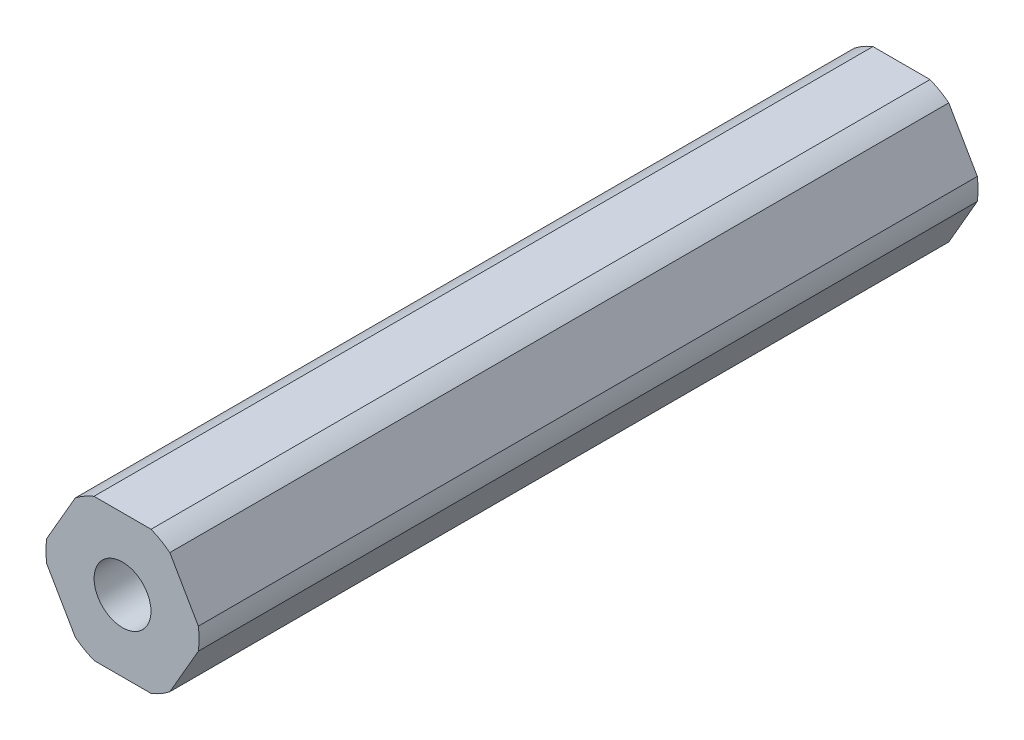
ISO-10303-21;
HEADER;
FILE_DESCRIPTION(('STEP AP214'),'2;1');
FILE_NAME('part.step','',(''),(''),'','','');
FILE_SCHEMA(('AUTOMOTIVE_DESIGN { 1 0 10303 214 1 1 1 1 }'));
ENDSEC;
DATA;
#1=APPLICATION_CONTEXT('core data for automotive mechanical design processes');
#2=APPLICATION_PROTOCOL_DEFINITION('international standard','automotive_design',2000,#1);
#3=PRODUCT_CONTEXT('',#1,'mechanical');
#4=PRODUCT('Part','Part','',(#3));
#5=PRODUCT_RELATED_PRODUCT_CATEGORY('part','',(#4));
#6=PRODUCT_DEFINITION_FORMATION('','',#4);
#7=PRODUCT_DEFINITION_CONTEXT('part definition',#1,'design');
#8=PRODUCT_DEFINITION('design','',#6,#7);
#9=PRODUCT_DEFINITION_SHAPE('','',#8);
#10=(LENGTH_UNIT() NAMED_UNIT(*) SI_UNIT(.MILLI.,.METRE.));
#11=(NAMED_UNIT(*) PLANE_ANGLE_UNIT() SI_UNIT($,.RADIAN.));
#12=(NAMED_UNIT(*) SI_UNIT($,.STERADIAN.) SOLID_ANGLE_UNIT());
#13=UNCERTAINTY_MEASURE_WITH_UNIT(LENGTH_MEASURE(1.E-05),#10,'distance_accuracy_value','');
#14=(GEOMETRIC_REPRESENTATION_CONTEXT(3) GLOBAL_UNCERTAINTY_ASSIGNED_CONTEXT((#13)) GLOBAL_UNIT_ASSIGNED_CONTEXT((#10,
#11,#12)) REPRESENTATION_CONTEXT('',''));
#15=CARTESIAN_POINT('',(0.,0.,0.));
#16=DIRECTION('',(0.,0.,1.));
#17=DIRECTION('',(1.,0.,0.));
#18=AXIS2_PLACEMENT_3D('',#15,#16,#17);
#19=CARTESIAN_POINT('',(0.,0.,-457.2));
#20=DIRECTION('',(0.,0.,1.));
#21=DIRECTION('',(1.,0.,0.));
#22=AXIS2_PLACEMENT_3D('',#19,#20,#21);
#23=CYLINDRICAL_SURFACE('',#22,6.87);
#24=CARTESIAN_POINT('',(0.,0.,387.35));
#25=DIRECTION('',(0.,0.,1.));
#26=DIRECTION('',(1.,0.,0.));
#27=AXIS2_PLACEMENT_3D('',#24,#25,#26);
#28=CIRCLE('',#27,6.87);
#29=CARTESIAN_POINT('',(6.80102150534208,0.971085209378948,387.35));
#30=VERTEX_POINT('',#29);
#31=CARTESIAN_POINT('',(6.80102150534208,-0.971085209378953,387.35));
#32=VERTEX_POINT('',#31);
#33=EDGE_CURVE('E248',#30,#32,#28,.F.);
#34=ORIENTED_EDGE('',*,*,#33,.F.);
#35=DIRECTION('',(0.,0.,1.));
#36=VECTOR('',#35,1.);
#37=CARTESIAN_POINT('',(6.80102150534208,0.97108520937895,457.2));
#38=LINE('',#37,#36);
#39=CARTESIAN_POINT('',(6.80102150534208,0.971085209378948,457.2));
#40=VERTEX_POINT('',#39);
#41=EDGE_CURVE('E139',#30,#40,#38,.T.);
#42=ORIENTED_EDGE('',*,*,#41,.T.);
#43=CARTESIAN_POINT('',(0.,0.,457.2));
#44=DIRECTION('',(0.,0.,1.));
#45=DIRECTION('',(1.,0.,0.));
#46=AXIS2_PLACEMENT_3D('',#43,#44,#45);
#47=CIRCLE('',#46,6.87);
#48=CARTESIAN_POINT('',(6.80102150534208,-0.971085209378954,457.2));
#49=VERTEX_POINT('',#48);
#50=EDGE_CURVE('E58',#40,#49,#47,.F.);
#51=ORIENTED_EDGE('',*,*,#50,.T.);
#52=DIRECTION('',(0.,0.,1.));
#53=VECTOR('',#52,1.);
#54=CARTESIAN_POINT('',(6.80102150534208,-0.971085209378955,457.2));
#55=LINE('',#54,#53);
#56=EDGE_CURVE('E154',#49,#32,#55,.F.);
#57=ORIENTED_EDGE('',*,*,#56,.T.);
#58=EDGE_LOOP('',(#34,#42,#51,#57));
#59=FACE_BOUND('',#58,.T.);
#60=ADVANCED_FACE('F34',(#59),#23,.T.);
#61=CARTESIAN_POINT('',(3.68083890619154,6.3754,457.2));
#62=DIRECTION('',(0.,-1.,0.));
#63=DIRECTION('',(1.,0.,0.));
#64=AXIS2_PLACEMENT_3D('',#61,#62,#63);
#65=PLANE('',#64);
#66=DIRECTION('',(0.,0.,1.));
#67=VECTOR('',#66,1.);
#68=CARTESIAN_POINT('',(2.55952629210953,6.37540000000001,-457.2));
#69=LINE('',#68,#67);
#70=CARTESIAN_POINT('',(2.55952629210953,6.37540000000001,387.35));
#71=VERTEX_POINT('',#70);
#72=CARTESIAN_POINT('',(2.55952629210953,6.37540000000001,457.2));
#73=VERTEX_POINT('',#72);
#74=EDGE_CURVE('E144',#71,#73,#69,.T.);
#75=ORIENTED_EDGE('',*,*,#74,.F.);
#76=DIRECTION('',(-1.,0.,0.));
#77=VECTOR('',#76,1.);
#78=CARTESIAN_POINT('',(3.68083890619154,6.3754,387.35));
#79=LINE('',#78,#77);
#80=CARTESIAN_POINT('',(-2.55952629210953,6.3754,387.35));
#81=VERTEX_POINT('',#80);
#82=EDGE_CURVE('E50',#71,#81,#79,.T.);
#83=ORIENTED_EDGE('',*,*,#82,.T.);
#84=DIRECTION('',(0.,0.,1.));
#85=VECTOR('',#84,1.);
#86=CARTESIAN_POINT('',(-2.55952629210953,6.37540000000001,-457.2));
#87=LINE('',#86,#85);
#88=CARTESIAN_POINT('',(-2.55952629210953,6.37540000000001,457.2));
#89=VERTEX_POINT('',#88);
#90=EDGE_CURVE('E171',#89,#81,#87,.F.);
#91=ORIENTED_EDGE('',*,*,#90,.F.);
#92=DIRECTION('',(1.,0.,0.));
#93=VECTOR('',#92,1.);
#94=CARTESIAN_POINT('',(0.,6.3754,457.2));
#95=LINE('',#94,#93);
#96=EDGE_CURVE('E189',#73,#89,#95,.F.);
#97=ORIENTED_EDGE('',*,*,#96,.F.);
#98=EDGE_LOOP('',(#75,#83,#91,#97));
#99=FACE_BOUND('',#98,.T.);
#100=ADVANCED_FACE('F211',(#99),#65,.F.);
#101=CARTESIAN_POINT('',(0.,0.,-457.2));
#102=DIRECTION('',(0.,0.,1.));
#103=DIRECTION('',(1.,0.,0.));
#104=AXIS2_PLACEMENT_3D('',#101,#102,#103);
#105=CYLINDRICAL_SURFACE('',#104,6.87);
#106=CARTESIAN_POINT('',(0.,0.,387.35));
#107=DIRECTION('',(0.,0.,1.));
#108=DIRECTION('',(1.,0.,0.));
#109=AXIS2_PLACEMENT_3D('',#106,#107,#108);
#110=CIRCLE('',#109,6.87);
#111=CARTESIAN_POINT('',(-4.24149521323255,5.40431479062104,387.35));
#112=VERTEX_POINT('',#111);
#113=EDGE_CURVE('E190',#112,#81,#110,.F.);
#114=ORIENTED_EDGE('',*,*,#113,.F.);
#115=DIRECTION('',(0.,0.,1.));
#116=VECTOR('',#115,1.);
#117=CARTESIAN_POINT('',(-4.24149521323255,5.40431479062104,457.2));
#118=LINE('',#117,#116);
#119=CARTESIAN_POINT('',(-4.24149521323255,5.40431479062105,457.2));
#120=VERTEX_POINT('',#119);
#121=EDGE_CURVE('E169',#112,#120,#118,.T.);
#122=ORIENTED_EDGE('',*,*,#121,.T.);
#123=CARTESIAN_POINT('',(0.,0.,457.2));
#124=DIRECTION('',(0.,0.,1.));
#125=DIRECTION('',(1.,0.,0.));
#126=AXIS2_PLACEMENT_3D('',#123,#124,#125);
#127=CIRCLE('',#126,6.87);
#128=EDGE_CURVE('E186',#89,#120,#127,.T.);
#129=ORIENTED_EDGE('',*,*,#128,.F.);
#130=ORIENTED_EDGE('',*,*,#90,.T.);
#131=EDGE_LOOP('',(#114,#122,#129,#130));
#132=FACE_BOUND('',#131,.T.);
#133=ADVANCED_FACE('F213',(#132),#105,.T.);
#134=CARTESIAN_POINT('',(-3.68083890619154,6.3754,457.2));
#135=DIRECTION('',(0.866025403784439,-0.5,0.));
#136=DIRECTION('',(0.5,0.866025403784439,0.));
#137=AXIS2_PLACEMENT_3D('',#134,#135,#136);
#138=PLANE('',#137);
#139=ORIENTED_EDGE('',*,*,#121,.F.);
#140=DIRECTION('',(-0.5,-0.866025403784439,0.));
#141=VECTOR('',#140,1.);
#142=CARTESIAN_POINT('',(-3.68083890619154,6.3754,387.35));
#143=LINE('',#142,#141);
#144=CARTESIAN_POINT('',(-6.80102150534208,0.971085209378961,387.35));
#145=VERTEX_POINT('',#144);
#146=EDGE_CURVE('E191',#112,#145,#143,.T.);
#147=ORIENTED_EDGE('',*,*,#146,.T.);
#148=DIRECTION('',(0.,0.,1.));
#149=VECTOR('',#148,1.);
#150=CARTESIAN_POINT('',(-6.80102150534208,0.971085209378959,-457.2));
#151=LINE('',#150,#149);
#152=CARTESIAN_POINT('',(-6.80102150534208,0.971085209378961,457.2));
#153=VERTEX_POINT('',#152);
#154=EDGE_CURVE('E166',#153,#145,#151,.F.);
#155=ORIENTED_EDGE('',*,*,#154,.F.);
#156=DIRECTION('',(-0.5,-0.866025403784439,0.));
#157=VECTOR('',#156,1.);
#158=CARTESIAN_POINT('',(-4.24149521323255,5.40431479062104,457.2));
#159=LINE('',#158,#157);
#160=EDGE_CURVE('E185',#120,#153,#159,.T.);
#161=ORIENTED_EDGE('',*,*,#160,.F.);
#162=EDGE_LOOP('',(#139,#147,#155,#161));
#163=FACE_BOUND('',#162,.T.);
#164=ADVANCED_FACE('F216',(#163),#138,.F.);
#165=CARTESIAN_POINT('',(0.,0.,-457.2));
#166=DIRECTION('',(0.,0.,1.));
#167=DIRECTION('',(1.,0.,0.));
#168=AXIS2_PLACEMENT_3D('',#165,#166,#167);
#169=CYLINDRICAL_SURFACE('',#168,6.87);
#170=CARTESIAN_POINT('',(0.,0.,387.35));
#171=DIRECTION('',(0.,0.,1.));
#172=DIRECTION('',(1.,0.,0.));
#173=AXIS2_PLACEMENT_3D('',#170,#171,#172);
#174=CIRCLE('',#173,6.87);
#175=CARTESIAN_POINT('',(-6.80102150534208,-0.971085209378955,387.35));
#176=VERTEX_POINT('',#175);
#177=EDGE_CURVE('E195',#176,#145,#174,.F.);
#178=ORIENTED_EDGE('',*,*,#177,.F.);
#179=DIRECTION('',(0.,0.,1.));
#180=VECTOR('',#179,1.);
#181=CARTESIAN_POINT('',(-6.80102150534208,-0.971085209378956,457.2));
#182=LINE('',#181,#180);
#183=CARTESIAN_POINT('',(-6.80102150534208,-0.971085209378955,457.2));
#184=VERTEX_POINT('',#183);
#185=EDGE_CURVE('E164',#176,#184,#182,.T.);
#186=ORIENTED_EDGE('',*,*,#185,.T.);
#187=CARTESIAN_POINT('',(0.,0.,457.2));
#188=DIRECTION('',(0.,0.,1.));
#189=DIRECTION('',(1.,0.,0.));
#190=AXIS2_PLACEMENT_3D('',#187,#188,#189);
#191=CIRCLE('',#190,6.87);
#192=EDGE_CURVE('E182',#153,#184,#191,.T.);
#193=ORIENTED_EDGE('',*,*,#192,.F.);
#194=ORIENTED_EDGE('',*,*,#154,.T.);
#195=EDGE_LOOP('',(#178,#186,#193,#194));
#196=FACE_BOUND('',#195,.T.);
#197=ADVANCED_FACE('F259',(#196),#169,.T.);
#198=CARTESIAN_POINT('',(-7.36167781238308,0.,457.2));
#199=DIRECTION('',(0.866025403784439,0.5,0.));
#200=DIRECTION('',(-0.5,0.866025403784439,0.));
#201=AXIS2_PLACEMENT_3D('',#198,#199,#200);
#202=PLANE('',#201);
#203=ORIENTED_EDGE('',*,*,#185,.F.);
#204=DIRECTION('',(0.5,-0.866025403784439,0.));
#205=VECTOR('',#204,1.);
#206=CARTESIAN_POINT('',(-7.36167781238308,0.,387.35));
#207=LINE('',#206,#205);
#208=CARTESIAN_POINT('',(-4.24149521323254,-5.40431479062105,387.35));
#209=VERTEX_POINT('',#208);
#210=EDGE_CURVE('E227',#176,#209,#207,.T.);
#211=ORIENTED_EDGE('',*,*,#210,.T.);
#212=DIRECTION('',(0.,0.,1.));
#213=VECTOR('',#212,1.);
#214=CARTESIAN_POINT('',(-4.24149521323255,-5.40431479062105,-457.2));
#215=LINE('',#214,#213);
#216=CARTESIAN_POINT('',(-4.24149521323255,-5.40431479062105,457.2));
#217=VERTEX_POINT('',#216);
#218=EDGE_CURVE('E161',#217,#209,#215,.F.);
#219=ORIENTED_EDGE('',*,*,#218,.F.);
#220=DIRECTION('',(0.5,-0.866025403784439,0.));
#221=VECTOR('',#220,1.);
#222=CARTESIAN_POINT('',(-6.80102150534208,-0.971085209378956,457.2));
#223=LINE('',#222,#221);
#224=EDGE_CURVE('E181',#184,#217,#223,.T.);
#225=ORIENTED_EDGE('',*,*,#224,.F.);
#226=EDGE_LOOP('',(#203,#211,#219,#225));
#227=FACE_BOUND('',#226,.T.);
#228=ADVANCED_FACE('F224',(#227),#202,.F.);
#229=CARTESIAN_POINT('',(0.,0.,-457.2));
#230=DIRECTION('',(0.,0.,1.));
#231=DIRECTION('',(1.,0.,0.));
#232=AXIS2_PLACEMENT_3D('',#229,#230,#231);
#233=CYLINDRICAL_SURFACE('',#232,6.87);
#234=CARTESIAN_POINT('',(0.,0.,387.35));
#235=DIRECTION('',(0.,0.,1.));
#236=DIRECTION('',(1.,0.,0.));
#237=AXIS2_PLACEMENT_3D('',#234,#235,#236);
#238=CIRCLE('',#237,6.87);
#239=CARTESIAN_POINT('',(-2.55952629210953,-6.3754,387.35));
#240=VERTEX_POINT('',#239);
#241=EDGE_CURVE('E256',#240,#209,#238,.F.);
#242=ORIENTED_EDGE('',*,*,#241,.F.);
#243=DIRECTION('',(0.,0.,1.));
#244=VECTOR('',#243,1.);
#245=CARTESIAN_POINT('',(-2.55952629210953,-6.3754,457.2));
#246=LINE('',#245,#244);
#247=CARTESIAN_POINT('',(-2.55952629210953,-6.3754,457.2));
#248=VERTEX_POINT('',#247);
#249=EDGE_CURVE('E159',#240,#248,#246,.T.);
#250=ORIENTED_EDGE('',*,*,#249,.T.);
#251=CARTESIAN_POINT('',(0.,0.,457.2));
#252=DIRECTION('',(0.,0.,1.));
#253=DIRECTION('',(1.,0.,0.));
#254=AXIS2_PLACEMENT_3D('',#251,#252,#253);
#255=CIRCLE('',#254,6.87);
#256=EDGE_CURVE('E178',#217,#248,#255,.T.);
#257=ORIENTED_EDGE('',*,*,#256,.F.);
#258=ORIENTED_EDGE('',*,*,#218,.T.);
#259=EDGE_LOOP('',(#242,#250,#257,#258));
#260=FACE_BOUND('',#259,.T.);
#261=ADVANCED_FACE('F230',(#260),#233,.T.);
#262=CARTESIAN_POINT('',(-3.68083890619154,-6.3754,457.2));
#263=DIRECTION('',(0.,1.,0.));
#264=DIRECTION('',(0.,0.,1.));
#265=AXIS2_PLACEMENT_3D('',#262,#263,#264);
#266=PLANE('',#265);
#267=ORIENTED_EDGE('',*,*,#249,.F.);
#268=DIRECTION('',(1.,0.,0.));
#269=VECTOR('',#268,1.);
#270=CARTESIAN_POINT('',(-3.68083890619154,-6.3754,387.35));
#271=LINE('',#270,#269);
#272=CARTESIAN_POINT('',(2.55952629210953,-6.3754,387.35));
#273=VERTEX_POINT('',#272);
#274=EDGE_CURVE('E238',#240,#273,#271,.T.);
#275=ORIENTED_EDGE('',*,*,#274,.T.);
#276=DIRECTION('',(0.,0.,1.));
#277=VECTOR('',#276,1.);
#278=CARTESIAN_POINT('',(2.55952629210953,-6.3754,-457.2));
#279=LINE('',#278,#277);
#280=CARTESIAN_POINT('',(2.55952629210953,-6.3754,457.2));
#281=VERTEX_POINT('',#280);
#282=EDGE_CURVE('E156',#281,#273,#279,.F.);
#283=ORIENTED_EDGE('',*,*,#282,.F.);
#284=DIRECTION('',(1.,0.,0.));
#285=VECTOR('',#284,1.);
#286=CARTESIAN_POINT('',(0.,-6.3754,457.2));
#287=LINE('',#286,#285);
#288=EDGE_CURVE('E177',#248,#281,#287,.T.);
#289=ORIENTED_EDGE('',*,*,#288,.F.);
#290=EDGE_LOOP('',(#267,#275,#283,#289));
#291=FACE_BOUND('',#290,.T.);
#292=ADVANCED_FACE('F235',(#291),#266,.F.);
#293=CARTESIAN_POINT('',(0.,0.,-457.2));
#294=DIRECTION('',(0.,0.,1.));
#295=DIRECTION('',(1.,0.,0.));
#296=AXIS2_PLACEMENT_3D('',#293,#294,#295);
#297=CYLINDRICAL_SURFACE('',#296,6.87);
#298=CARTESIAN_POINT('',(0.,0.,387.35));
#299=DIRECTION('',(0.,0.,1.));
#300=DIRECTION('',(1.,0.,0.));
#301=AXIS2_PLACEMENT_3D('',#298,#299,#300);
#302=CIRCLE('',#301,6.87);
#303=CARTESIAN_POINT('',(4.24149521323254,-5.40431479062105,387.35));
#304=VERTEX_POINT('',#303);
#305=EDGE_CURVE('E250',#304,#273,#302,.F.);
#306=ORIENTED_EDGE('',*,*,#305,.F.);
#307=DIRECTION('',(0.,0.,1.));
#308=VECTOR('',#307,1.);
#309=CARTESIAN_POINT('',(4.24149521323254,-5.40431479062105,457.2));
#310=LINE('',#309,#308);
#311=CARTESIAN_POINT('',(4.24149521323254,-5.40431479062105,457.2));
#312=VERTEX_POINT('',#311);
#313=EDGE_CURVE('E148',#304,#312,#310,.T.);
#314=ORIENTED_EDGE('',*,*,#313,.T.);
#315=CARTESIAN_POINT('',(0.,0.,457.2));
#316=DIRECTION('',(0.,0.,1.));
#317=DIRECTION('',(1.,0.,0.));
#318=AXIS2_PLACEMENT_3D('',#315,#316,#317);
#319=CIRCLE('',#318,6.87);
#320=EDGE_CURVE('E174',#281,#312,#319,.T.);
#321=ORIENTED_EDGE('',*,*,#320,.F.);
#322=ORIENTED_EDGE('',*,*,#282,.T.);
#323=EDGE_LOOP('',(#306,#314,#321,#322));
#324=FACE_BOUND('',#323,.T.);
#325=ADVANCED_FACE('F241',(#324),#297,.T.);
#326=CARTESIAN_POINT('',(3.68083890619154,-6.3754,457.2));
#327=DIRECTION('',(-0.866025403784439,0.5,0.));
#328=DIRECTION('',(-0.5,-0.866025403784439,0.));
#329=AXIS2_PLACEMENT_3D('',#326,#327,#328);
#330=PLANE('',#329);
#331=ORIENTED_EDGE('',*,*,#313,.F.);
#332=DIRECTION('',(0.5,0.866025403784439,0.));
#333=VECTOR('',#332,1.);
#334=CARTESIAN_POINT('',(3.68083890619154,-6.3754,387.35));
#335=LINE('',#334,#333);
#336=EDGE_CURVE('E247',#304,#32,#335,.T.);
#337=ORIENTED_EDGE('',*,*,#336,.T.);
#338=ORIENTED_EDGE('',*,*,#56,.F.);
#339=DIRECTION('',(0.5,0.866025403784439,0.));
#340=VECTOR('',#339,1.);
#341=CARTESIAN_POINT('',(4.24149521323254,-5.40431479062105,457.2));
#342=LINE('',#341,#340);
#343=EDGE_CURVE('E42',#312,#49,#342,.T.);
#344=ORIENTED_EDGE('',*,*,#343,.F.);
#345=EDGE_LOOP('',(#331,#337,#338,#344));
#346=FACE_BOUND('',#345,.T.);
#347=ADVANCED_FACE('F245',(#346),#330,.F.);
#348=CARTESIAN_POINT('',(7.36167781238308,0.,457.2));
#349=DIRECTION('',(-0.866025403784439,-0.5,0.));
#350=DIRECTION('',(0.5,-0.866025403784439,0.));
#351=AXIS2_PLACEMENT_3D('',#348,#349,#350);
#352=PLANE('',#351);
#353=ORIENTED_EDGE('',*,*,#41,.F.);
#354=DIRECTION('',(-0.5,0.866025403784439,0.));
#355=VECTOR('',#354,1.);
#356=CARTESIAN_POINT('',(7.36167781238308,0.,387.35));
#357=LINE('',#356,#355);
#358=CARTESIAN_POINT('',(4.24149521323254,5.40431479062105,387.35));
#359=VERTEX_POINT('',#358);
#360=EDGE_CURVE('E126',#30,#359,#357,.T.);
#361=ORIENTED_EDGE('',*,*,#360,.T.);
#362=DIRECTION('',(0.,0.,1.));
#363=VECTOR('',#362,1.);
#364=CARTESIAN_POINT('',(4.24149521323254,5.40431479062105,-457.2));
#365=LINE('',#364,#363);
#366=CARTESIAN_POINT('',(4.24149521323254,5.40431479062105,457.2));
#367=VERTEX_POINT('',#366);
#368=EDGE_CURVE('E137',#367,#359,#365,.F.);
#369=ORIENTED_EDGE('',*,*,#368,.F.);
#370=DIRECTION('',(-0.5,0.866025403784438,0.));
#371=VECTOR('',#370,1.);
#372=CARTESIAN_POINT('',(6.80102150534208,0.97108520937895,457.2));
#373=LINE('',#372,#371);
#374=EDGE_CURVE('E146',#40,#367,#373,.T.);
#375=ORIENTED_EDGE('',*,*,#374,.F.);
#376=EDGE_LOOP('',(#353,#361,#369,#375));
#377=FACE_BOUND('',#376,.T.);
#378=ADVANCED_FACE('F135',(#377),#352,.F.);
#379=CARTESIAN_POINT('',(0.,0.,-457.2));
#380=DIRECTION('',(0.,0.,1.));
#381=DIRECTION('',(1.,0.,0.));
#382=AXIS2_PLACEMENT_3D('',#379,#380,#381);
#383=CYLINDRICAL_SURFACE('',#382,6.87);
#384=CARTESIAN_POINT('',(0.,0.,387.35));
#385=DIRECTION('',(0.,0.,1.));
#386=DIRECTION('',(1.,0.,0.));
#387=AXIS2_PLACEMENT_3D('',#384,#385,#386);
#388=CIRCLE('',#387,6.87);
#389=EDGE_CURVE('E122',#71,#359,#388,.F.);
#390=ORIENTED_EDGE('',*,*,#389,.F.);
#391=ORIENTED_EDGE('',*,*,#74,.T.);
#392=CARTESIAN_POINT('',(0.,0.,457.2));
#393=DIRECTION('',(0.,0.,1.));
#394=DIRECTION('',(1.,0.,0.));
#395=AXIS2_PLACEMENT_3D('',#392,#393,#394);
#396=CIRCLE('',#395,6.87);
#397=EDGE_CURVE('E143',#367,#73,#396,.T.);
#398=ORIENTED_EDGE('',*,*,#397,.F.);
#399=ORIENTED_EDGE('',*,*,#368,.T.);
#400=EDGE_LOOP('',(#390,#391,#398,#399));
#401=FACE_BOUND('',#400,.T.);
#402=ADVANCED_FACE('F141',(#401),#383,.T.);
#403=CARTESIAN_POINT('',(0.,0.,457.2));
#404=DIRECTION('',(0.,0.,1.));
#405=DIRECTION('',(1.,0.,0.));
#406=AXIS2_PLACEMENT_3D('',#403,#404,#405);
#407=PLANE('',#406);
#408=ORIENTED_EDGE('',*,*,#343,.T.);
#409=ORIENTED_EDGE('',*,*,#50,.F.);
#410=ORIENTED_EDGE('',*,*,#374,.T.);
#411=ORIENTED_EDGE('',*,*,#397,.T.);
#412=ORIENTED_EDGE('',*,*,#96,.T.);
#413=ORIENTED_EDGE('',*,*,#128,.T.);
#414=ORIENTED_EDGE('',*,*,#160,.T.);
#415=ORIENTED_EDGE('',*,*,#192,.T.);
#416=ORIENTED_EDGE('',*,*,#224,.T.);
#417=ORIENTED_EDGE('',*,*,#256,.T.);
#418=ORIENTED_EDGE('',*,*,#288,.T.);
#419=ORIENTED_EDGE('',*,*,#320,.T.);
#420=EDGE_LOOP('',(#408,#409,#410,#411,#412,#413,#414,#415,#416,#417,#418,#419));
#421=FACE_BOUND('',#420,.T.);
#422=CARTESIAN_POINT('',(0.,0.,457.2));
#423=DIRECTION('',(0.,0.,1.));
#424=DIRECTION('',(1.,0.,0.));
#425=AXIS2_PLACEMENT_3D('',#422,#423,#424);
#426=CIRCLE('',#425,2.55);
#427=CARTESIAN_POINT('',(2.55,0.,457.2));
#428=VERTEX_POINT('',#427);
#429=EDGE_CURVE('E11',#428,#428,#426,.F.);
#430=ORIENTED_EDGE('',*,*,#429,.T.);
#431=EDGE_LOOP('',(#430));
#432=FACE_BOUND('',#431,.T.);
#433=ADVANCED_FACE('F206',(#421,#432),#407,.T.);
#434=CARTESIAN_POINT('',(0.,0.,-457.2));
#435=DIRECTION('',(0.,0.,1.));
#436=DIRECTION('',(1.,0.,0.));
#437=AXIS2_PLACEMENT_3D('',#434,#435,#436);
#438=CYLINDRICAL_SURFACE('',#437,2.55);
#439=CARTESIAN_POINT('',(0.,0.,387.35));
#440=DIRECTION('',(0.,0.,1.));
#441=DIRECTION('',(1.,0.,0.));
#442=AXIS2_PLACEMENT_3D('',#439,#440,#441);
#443=CIRCLE('',#442,2.55);
#444=CARTESIAN_POINT('',(2.55,0.,387.35));
#445=VERTEX_POINT('',#444);
#446=EDGE_CURVE('E37',#445,#445,#443,.F.);
#447=ORIENTED_EDGE('',*,*,#446,.T.);
#448=EDGE_LOOP('',(#447));
#449=FACE_BOUND('',#448,.T.);
#450=ORIENTED_EDGE('',*,*,#429,.F.);
#451=EDGE_LOOP('',(#450));
#452=FACE_BOUND('',#451,.T.);
#453=ADVANCED_FACE('F268',(#449,#452),#438,.F.);
#454=CARTESIAN_POINT('',(0.,0.,387.35));
#455=DIRECTION('',(0.,0.,1.));
#456=DIRECTION('',(1.,0.,0.));
#457=AXIS2_PLACEMENT_3D('',#454,#455,#456);
#458=PLANE('',#457);
#459=ORIENTED_EDGE('',*,*,#113,.T.);
#460=ORIENTED_EDGE('',*,*,#82,.F.);
#461=ORIENTED_EDGE('',*,*,#389,.T.);
#462=ORIENTED_EDGE('',*,*,#360,.F.);
#463=ORIENTED_EDGE('',*,*,#33,.T.);
#464=ORIENTED_EDGE('',*,*,#336,.F.);
#465=ORIENTED_EDGE('',*,*,#305,.T.);
#466=ORIENTED_EDGE('',*,*,#274,.F.);
#467=ORIENTED_EDGE('',*,*,#241,.T.);
#468=ORIENTED_EDGE('',*,*,#210,.F.);
#469=ORIENTED_EDGE('',*,*,#177,.T.);
#470=ORIENTED_EDGE('',*,*,#146,.F.);
#471=EDGE_LOOP('',(#459,#460,#461,#462,#463,#464,#465,#466,#467,#468,#469,#470));
#472=FACE_BOUND('',#471,.T.);
#473=ORIENTED_EDGE('',*,*,#446,.F.);
#474=EDGE_LOOP('',(#473));
#475=FACE_BOUND('',#474,.T.);
#476=ADVANCED_FACE('F124',(#472,#475),#458,.F.);
#477=CLOSED_SHELL('',(#60,#100,#133,#164,#197,#228,#261,#292,#325,#347,#378,#402,#433,#453,#476));
#478=MANIFOLD_SOLID_BREP('B2',#477);
#479=ADVANCED_BREP_SHAPE_REPRESENTATION('',(#18,#478),#14);
#480=SHAPE_DEFINITION_REPRESENTATION(#9,#479);
ENDSEC;
END-ISO-10303-21;
